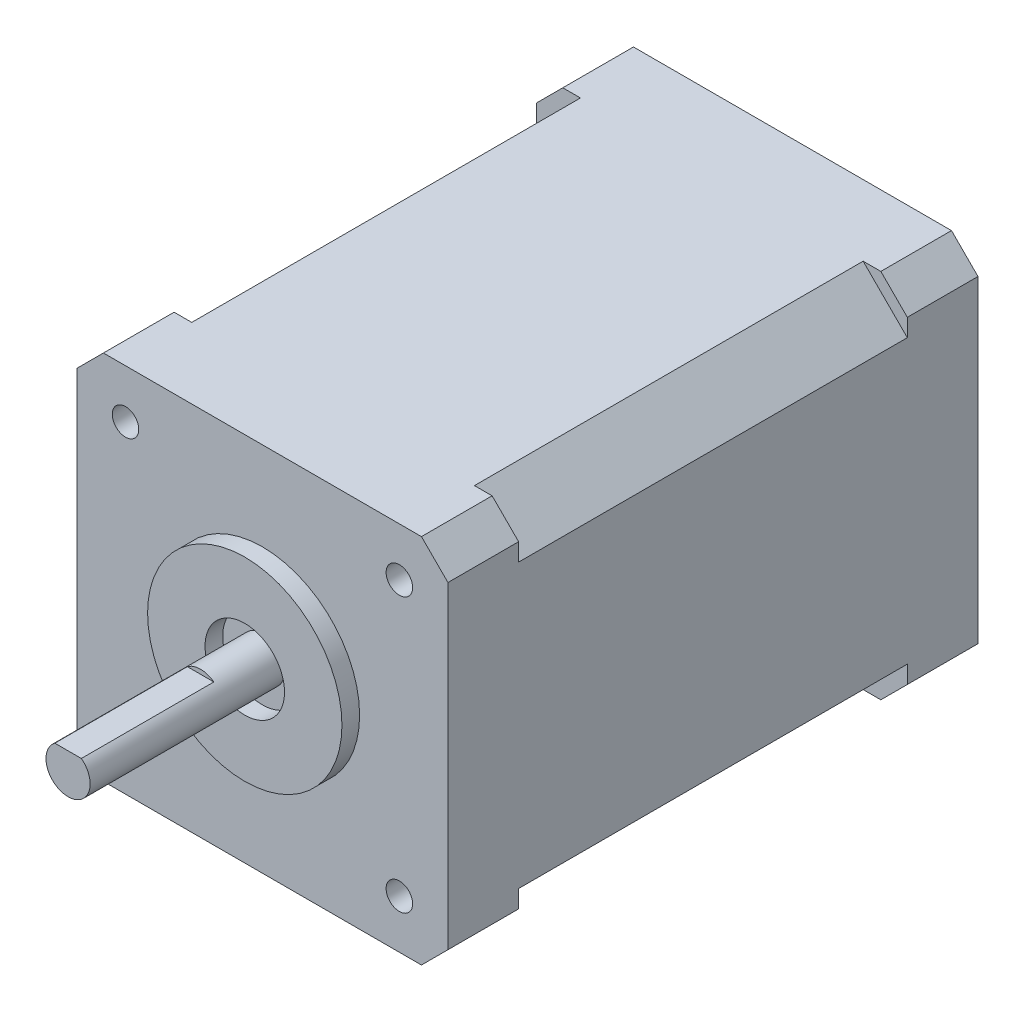
ISO-10303-21;
HEADER;
FILE_DESCRIPTION(('STEP AP214'),'2;1');
FILE_NAME('part.step','',(''),(''),'','','');
FILE_SCHEMA(('AUTOMOTIVE_DESIGN { 1 0 10303 214 1 1 1 1 }'));
ENDSEC;
DATA;
#1=APPLICATION_CONTEXT('core data for automotive mechanical design processes');
#2=APPLICATION_PROTOCOL_DEFINITION('international standard','automotive_design',2000,#1);
#3=PRODUCT_CONTEXT('',#1,'mechanical');
#4=PRODUCT('Part','Part','',(#3));
#5=PRODUCT_RELATED_PRODUCT_CATEGORY('part','',(#4));
#6=PRODUCT_DEFINITION_FORMATION('','',#4);
#7=PRODUCT_DEFINITION_CONTEXT('part definition',#1,'design');
#8=PRODUCT_DEFINITION('design','',#6,#7);
#9=PRODUCT_DEFINITION_SHAPE('','',#8);
#10=(LENGTH_UNIT() NAMED_UNIT(*) SI_UNIT(.MILLI.,.METRE.));
#11=(NAMED_UNIT(*) PLANE_ANGLE_UNIT() SI_UNIT($,.RADIAN.));
#12=(NAMED_UNIT(*) SI_UNIT($,.STERADIAN.) SOLID_ANGLE_UNIT());
#13=UNCERTAINTY_MEASURE_WITH_UNIT(LENGTH_MEASURE(1.E-05),#10,'distance_accuracy_value','');
#14=(GEOMETRIC_REPRESENTATION_CONTEXT(3) GLOBAL_UNCERTAINTY_ASSIGNED_CONTEXT((#13)) GLOBAL_UNIT_ASSIGNED_CONTEXT((#10,
#11,#12)) REPRESENTATION_CONTEXT('',''));
#15=CARTESIAN_POINT('',(0.,0.,0.));
#16=DIRECTION('',(0.,0.,1.));
#17=DIRECTION('',(1.,0.,0.));
#18=AXIS2_PLACEMENT_3D('',#15,#16,#17);
#19=CARTESIAN_POINT('',(0.,0.,52.));
#20=DIRECTION('',(0.,0.,-1.));
#21=DIRECTION('',(-1.,0.,0.));
#22=AXIS2_PLACEMENT_3D('',#19,#20,#21);
#23=PLANE('',#22);
#24=CARTESIAN_POINT('',(0.,0.,52.));
#25=DIRECTION('',(0.,0.,1.));
#26=DIRECTION('',(1.,0.,0.));
#27=AXIS2_PLACEMENT_3D('',#24,#25,#26);
#28=CIRCLE('',#27,4.5);
#29=CARTESIAN_POINT('',(4.5,0.,52.));
#30=VERTEX_POINT('',#29);
#31=EDGE_CURVE('E915',#30,#30,#28,.T.);
#32=ORIENTED_EDGE('',*,*,#31,.T.);
#33=EDGE_LOOP('',(#32));
#34=FACE_BOUND('',#33,.T.);
#35=CARTESIAN_POINT('',(0.,0.,52.));
#36=DIRECTION('',(0.,0.,-1.));
#37=DIRECTION('',(-1.,0.,0.));
#38=AXIS2_PLACEMENT_3D('',#35,#36,#37);
#39=CIRCLE('',#38,2.5);
#40=CARTESIAN_POINT('',(-2.5,0.,52.));
#41=VERTEX_POINT('',#40);
#42=EDGE_CURVE('E11',#41,#41,#39,.F.);
#43=ORIENTED_EDGE('',*,*,#42,.F.);
#44=EDGE_LOOP('',(#43));
#45=FACE_BOUND('',#44,.T.);
#46=ADVANCED_FACE('F37',(#34,#45),#23,.F.);
#47=CARTESIAN_POINT('',(-15.5,-15.5,52.));
#48=DIRECTION('',(0.,0.,1.));
#49=DIRECTION('',(1.,0.,0.));
#50=AXIS2_PLACEMENT_3D('',#47,#48,#49);
#51=CIRCLE('',#50,1.5);
#52=CARTESIAN_POINT('',(-14.,-15.5,52.));
#53=VERTEX_POINT('',#52);
#54=EDGE_CURVE('E878',#53,#53,#51,.T.);
#55=ORIENTED_EDGE('',*,*,#54,.F.);
#56=EDGE_LOOP('',(#55));
#57=FACE_BOUND('',#56,.T.);
#58=CARTESIAN_POINT('',(15.5,-15.5,52.));
#59=DIRECTION('',(0.,0.,1.));
#60=DIRECTION('',(1.,0.,0.));
#61=AXIS2_PLACEMENT_3D('',#58,#59,#60);
#62=CIRCLE('',#61,1.5);
#63=CARTESIAN_POINT('',(17.,-15.5,52.));
#64=VERTEX_POINT('',#63);
#65=EDGE_CURVE('E877',#64,#64,#62,.T.);
#66=ORIENTED_EDGE('',*,*,#65,.F.);
#67=EDGE_LOOP('',(#66));
#68=FACE_BOUND('',#67,.T.);
#69=CARTESIAN_POINT('',(15.5,15.5,52.));
#70=DIRECTION('',(0.,0.,1.));
#71=DIRECTION('',(1.,0.,0.));
#72=AXIS2_PLACEMENT_3D('',#69,#70,#71);
#73=CIRCLE('',#72,1.5);
#74=CARTESIAN_POINT('',(17.,15.5,52.));
#75=VERTEX_POINT('',#74);
#76=EDGE_CURVE('E887',#75,#75,#73,.T.);
#77=ORIENTED_EDGE('',*,*,#76,.F.);
#78=EDGE_LOOP('',(#77));
#79=FACE_BOUND('',#78,.T.);
#80=CARTESIAN_POINT('',(-15.5,15.5,52.));
#81=DIRECTION('',(0.,0.,1.));
#82=DIRECTION('',(1.,0.,0.));
#83=AXIS2_PLACEMENT_3D('',#80,#81,#82);
#84=CIRCLE('',#83,1.5);
#85=CARTESIAN_POINT('',(-14.,15.5,52.));
#86=VERTEX_POINT('',#85);
#87=EDGE_CURVE('E892',#86,#86,#84,.T.);
#88=ORIENTED_EDGE('',*,*,#87,.F.);
#89=EDGE_LOOP('',(#88));
#90=FACE_BOUND('',#89,.T.);
#91=DIRECTION('',(0.,-1.,0.));
#92=VECTOR('',#91,1.);
#93=CARTESIAN_POINT('',(-21.,-18.,52.));
#94=LINE('',#93,#92);
#95=CARTESIAN_POINT('',(-21.,18.,52.));
#96=VERTEX_POINT('',#95);
#97=CARTESIAN_POINT('',(-21.,-18.,52.));
#98=VERTEX_POINT('',#97);
#99=EDGE_CURVE('E377',#96,#98,#94,.T.);
#100=ORIENTED_EDGE('',*,*,#99,.T.);
#101=DIRECTION('',(0.707106781186548,-0.707106781186548,0.));
#102=VECTOR('',#101,1.);
#103=CARTESIAN_POINT('',(-21.,-18.,52.));
#104=LINE('',#103,#102);
#105=CARTESIAN_POINT('',(-18.,-21.,52.));
#106=VERTEX_POINT('',#105);
#107=EDGE_CURVE('E332',#98,#106,#104,.T.);
#108=ORIENTED_EDGE('',*,*,#107,.T.);
#109=DIRECTION('',(1.,0.,0.));
#110=VECTOR('',#109,1.);
#111=CARTESIAN_POINT('',(-18.,-21.,52.));
#112=LINE('',#111,#110);
#113=CARTESIAN_POINT('',(18.,-21.,52.));
#114=VERTEX_POINT('',#113);
#115=EDGE_CURVE('E511',#106,#114,#112,.T.);
#116=ORIENTED_EDGE('',*,*,#115,.T.);
#117=DIRECTION('',(0.707106781186548,0.707106781186548,0.));
#118=VECTOR('',#117,1.);
#119=CARTESIAN_POINT('',(18.,-21.,52.));
#120=LINE('',#119,#118);
#121=CARTESIAN_POINT('',(21.,-18.,52.));
#122=VERTEX_POINT('',#121);
#123=EDGE_CURVE('E508',#114,#122,#120,.T.);
#124=ORIENTED_EDGE('',*,*,#123,.T.);
#125=DIRECTION('',(0.,1.,0.));
#126=VECTOR('',#125,1.);
#127=CARTESIAN_POINT('',(21.,-18.,52.));
#128=LINE('',#127,#126);
#129=CARTESIAN_POINT('',(21.,18.,52.));
#130=VERTEX_POINT('',#129);
#131=EDGE_CURVE('E506',#122,#130,#128,.T.);
#132=ORIENTED_EDGE('',*,*,#131,.T.);
#133=DIRECTION('',(-0.707106781186548,0.707106781186548,0.));
#134=VECTOR('',#133,1.);
#135=CARTESIAN_POINT('',(18.,21.,52.));
#136=LINE('',#135,#134);
#137=CARTESIAN_POINT('',(18.,21.,52.));
#138=VERTEX_POINT('',#137);
#139=EDGE_CURVE('E356',#130,#138,#136,.T.);
#140=ORIENTED_EDGE('',*,*,#139,.T.);
#141=DIRECTION('',(-1.,0.,0.));
#142=VECTOR('',#141,1.);
#143=CARTESIAN_POINT('',(-18.,21.,52.));
#144=LINE('',#143,#142);
#145=CARTESIAN_POINT('',(-18.,21.,52.));
#146=VERTEX_POINT('',#145);
#147=EDGE_CURVE('E353',#138,#146,#144,.T.);
#148=ORIENTED_EDGE('',*,*,#147,.T.);
#149=DIRECTION('',(-0.707106781186548,-0.707106781186548,0.));
#150=VECTOR('',#149,1.);
#151=CARTESIAN_POINT('',(-21.,18.,52.));
#152=LINE('',#151,#150);
#153=EDGE_CURVE('E175',#146,#96,#152,.T.);
#154=ORIENTED_EDGE('',*,*,#153,.T.);
#155=EDGE_LOOP('',(#100,#108,#116,#124,#132,#140,#148,#154));
#156=FACE_BOUND('',#155,.T.);
#157=CARTESIAN_POINT('',(0.,0.,52.));
#158=DIRECTION('',(0.,0.,-1.));
#159=DIRECTION('',(-1.,0.,0.));
#160=AXIS2_PLACEMENT_3D('',#157,#158,#159);
#161=CIRCLE('',#160,11.);
#162=CARTESIAN_POINT('',(-11.,0.,52.));
#163=VERTEX_POINT('',#162);
#164=EDGE_CURVE('E45',#163,#163,#161,.F.);
#165=ORIENTED_EDGE('',*,*,#164,.F.);
#166=EDGE_LOOP('',(#165));
#167=FACE_BOUND('',#166,.T.);
#168=ADVANCED_FACE('F230',(#57,#68,#79,#90,#156,#167),#23,.F.);
#169=CARTESIAN_POINT('',(-21.,-16.,44.));
#170=DIRECTION('',(1.,0.,0.));
#171=DIRECTION('',(0.,0.,-1.));
#172=AXIS2_PLACEMENT_3D('',#169,#170,#171);
#173=PLANE('',#172);
#174=DIRECTION('',(0.,0.,-1.));
#175=VECTOR('',#174,1.);
#176=CARTESIAN_POINT('',(-21.,16.,44.));
#177=LINE('',#176,#175);
#178=CARTESIAN_POINT('',(-21.,16.,44.));
#179=VERTEX_POINT('',#178);
#180=CARTESIAN_POINT('',(-21.,16.,0.));
#181=VERTEX_POINT('',#180);
#182=EDGE_CURVE('E86',#179,#181,#177,.T.);
#183=ORIENTED_EDGE('',*,*,#182,.T.);
#184=DIRECTION('',(0.,1.,0.));
#185=VECTOR('',#184,1.);
#186=CARTESIAN_POINT('',(-21.,-18.,0.));
#187=LINE('',#186,#185);
#188=CARTESIAN_POINT('',(-21.,18.,0.));
#189=VERTEX_POINT('',#188);
#190=EDGE_CURVE('E388',#181,#189,#187,.T.);
#191=ORIENTED_EDGE('',*,*,#190,.T.);
#192=DIRECTION('',(0.,0.,1.));
#193=VECTOR('',#192,1.);
#194=CARTESIAN_POINT('',(-21.,18.,-8.));
#195=LINE('',#194,#193);
#196=CARTESIAN_POINT('',(-21.,18.,-8.));
#197=VERTEX_POINT('',#196);
#198=EDGE_CURVE('E955',#197,#189,#195,.T.);
#199=ORIENTED_EDGE('',*,*,#198,.F.);
#200=DIRECTION('',(0.,1.,0.));
#201=VECTOR('',#200,1.);
#202=CARTESIAN_POINT('',(-21.,-18.,-8.));
#203=LINE('',#202,#201);
#204=CARTESIAN_POINT('',(-21.,-18.,-8.));
#205=VERTEX_POINT('',#204);
#206=EDGE_CURVE('E935',#205,#197,#203,.T.);
#207=ORIENTED_EDGE('',*,*,#206,.F.);
#208=DIRECTION('',(0.,0.,1.));
#209=VECTOR('',#208,1.);
#210=CARTESIAN_POINT('',(-21.,-18.,-8.));
#211=LINE('',#210,#209);
#212=CARTESIAN_POINT('',(-21.,-18.,0.));
#213=VERTEX_POINT('',#212);
#214=EDGE_CURVE('E383',#205,#213,#211,.T.);
#215=ORIENTED_EDGE('',*,*,#214,.T.);
#216=CARTESIAN_POINT('',(-21.,-16.,0.));
#217=VERTEX_POINT('',#216);
#218=EDGE_CURVE('E379',#213,#217,#187,.T.);
#219=ORIENTED_EDGE('',*,*,#218,.T.);
#220=DIRECTION('',(0.,0.,-1.));
#221=VECTOR('',#220,1.);
#222=CARTESIAN_POINT('',(-21.,-16.,44.));
#223=LINE('',#222,#221);
#224=CARTESIAN_POINT('',(-21.,-16.,44.));
#225=VERTEX_POINT('',#224);
#226=EDGE_CURVE('E200',#225,#217,#223,.T.);
#227=ORIENTED_EDGE('',*,*,#226,.F.);
#228=DIRECTION('',(0.,-1.,0.));
#229=VECTOR('',#228,1.);
#230=CARTESIAN_POINT('',(-21.,-18.,44.));
#231=LINE('',#230,#229);
#232=CARTESIAN_POINT('',(-21.,-18.,44.));
#233=VERTEX_POINT('',#232);
#234=EDGE_CURVE('E165',#225,#233,#231,.T.);
#235=ORIENTED_EDGE('',*,*,#234,.T.);
#236=DIRECTION('',(0.,0.,-1.));
#237=VECTOR('',#236,1.);
#238=CARTESIAN_POINT('',(-21.,-18.,52.));
#239=LINE('',#238,#237);
#240=EDGE_CURVE('E212',#98,#233,#239,.T.);
#241=ORIENTED_EDGE('',*,*,#240,.F.);
#242=ORIENTED_EDGE('',*,*,#99,.F.);
#243=DIRECTION('',(0.,0.,-1.));
#244=VECTOR('',#243,1.);
#245=CARTESIAN_POINT('',(-21.,18.,52.));
#246=LINE('',#245,#244);
#247=CARTESIAN_POINT('',(-21.,18.,44.));
#248=VERTEX_POINT('',#247);
#249=EDGE_CURVE('E361',#96,#248,#246,.T.);
#250=ORIENTED_EDGE('',*,*,#249,.T.);
#251=EDGE_CURVE('E169',#248,#179,#231,.T.);
#252=ORIENTED_EDGE('',*,*,#251,.T.);
#253=EDGE_LOOP('',(#183,#191,#199,#207,#215,#219,#227,#235,#241,#242,#250,#252));
#254=FACE_BOUND('',#253,.T.);
#255=ADVANCED_FACE('F39',(#254),#173,.F.);
#256=CARTESIAN_POINT('',(-21.,-16.,44.));
#257=DIRECTION('',(0.707106781186548,0.707106781186548,0.));
#258=DIRECTION('',(-0.707106781186548,0.707106781186548,0.));
#259=AXIS2_PLACEMENT_3D('',#256,#257,#258);
#260=PLANE('',#259);
#261=DIRECTION('',(0.707106781186548,-0.707106781186548,0.));
#262=VECTOR('',#261,1.);
#263=CARTESIAN_POINT('',(-21.,-16.,0.));
#264=LINE('',#263,#262);
#265=CARTESIAN_POINT('',(-16.,-21.,0.));
#266=VERTEX_POINT('',#265);
#267=EDGE_CURVE('E208',#217,#266,#264,.T.);
#268=ORIENTED_EDGE('',*,*,#267,.T.);
#269=DIRECTION('',(0.,0.,-1.));
#270=VECTOR('',#269,1.);
#271=CARTESIAN_POINT('',(-16.,-21.,44.));
#272=LINE('',#271,#270);
#273=CARTESIAN_POINT('',(-16.,-21.,44.));
#274=VERTEX_POINT('',#273);
#275=EDGE_CURVE('E197',#274,#266,#272,.T.);
#276=ORIENTED_EDGE('',*,*,#275,.F.);
#277=DIRECTION('',(0.707106781186548,-0.707106781186548,0.));
#278=VECTOR('',#277,1.);
#279=CARTESIAN_POINT('',(-21.,-16.,44.));
#280=LINE('',#279,#278);
#281=EDGE_CURVE('E190',#225,#274,#280,.T.);
#282=ORIENTED_EDGE('',*,*,#281,.F.);
#283=ORIENTED_EDGE('',*,*,#226,.T.);
#284=EDGE_LOOP('',(#268,#276,#282,#283));
#285=FACE_BOUND('',#284,.T.);
#286=ADVANCED_FACE('F238',(#285),#260,.F.);
#287=CARTESIAN_POINT('',(-16.,-21.,44.));
#288=DIRECTION('',(0.,1.,0.));
#289=DIRECTION('',(0.,0.,1.));
#290=AXIS2_PLACEMENT_3D('',#287,#288,#289);
#291=PLANE('',#290);
#292=ORIENTED_EDGE('',*,*,#275,.T.);
#293=DIRECTION('',(-1.,0.,0.));
#294=VECTOR('',#293,1.);
#295=CARTESIAN_POINT('',(18.,-21.,0.));
#296=LINE('',#295,#294);
#297=CARTESIAN_POINT('',(-18.,-21.,0.));
#298=VERTEX_POINT('',#297);
#299=EDGE_CURVE('E75',#266,#298,#296,.T.);
#300=ORIENTED_EDGE('',*,*,#299,.T.);
#301=DIRECTION('',(0.,0.,1.));
#302=VECTOR('',#301,1.);
#303=CARTESIAN_POINT('',(-18.,-21.,-8.));
#304=LINE('',#303,#302);
#305=CARTESIAN_POINT('',(-18.,-21.,-8.));
#306=VERTEX_POINT('',#305);
#307=EDGE_CURVE('E440',#306,#298,#304,.T.);
#308=ORIENTED_EDGE('',*,*,#307,.F.);
#309=DIRECTION('',(-1.,0.,0.));
#310=VECTOR('',#309,1.);
#311=CARTESIAN_POINT('',(18.,-21.,-8.));
#312=LINE('',#311,#310);
#313=CARTESIAN_POINT('',(18.,-21.,-8.));
#314=VERTEX_POINT('',#313);
#315=EDGE_CURVE('E929',#314,#306,#312,.T.);
#316=ORIENTED_EDGE('',*,*,#315,.F.);
#317=DIRECTION('',(0.,0.,1.));
#318=VECTOR('',#317,1.);
#319=CARTESIAN_POINT('',(18.,-21.,-8.));
#320=LINE('',#319,#318);
#321=CARTESIAN_POINT('',(18.,-21.,0.));
#322=VERTEX_POINT('',#321);
#323=EDGE_CURVE('E959',#314,#322,#320,.T.);
#324=ORIENTED_EDGE('',*,*,#323,.T.);
#325=CARTESIAN_POINT('',(16.,-21.,0.));
#326=VERTEX_POINT('',#325);
#327=EDGE_CURVE('E430',#322,#326,#296,.T.);
#328=ORIENTED_EDGE('',*,*,#327,.T.);
#329=DIRECTION('',(0.,0.,-1.));
#330=VECTOR('',#329,1.);
#331=CARTESIAN_POINT('',(16.,-21.,44.));
#332=LINE('',#331,#330);
#333=CARTESIAN_POINT('',(16.,-21.,44.));
#334=VERTEX_POINT('',#333);
#335=EDGE_CURVE('E201',#334,#326,#332,.T.);
#336=ORIENTED_EDGE('',*,*,#335,.F.);
#337=DIRECTION('',(1.,0.,0.));
#338=VECTOR('',#337,1.);
#339=CARTESIAN_POINT('',(-18.,-21.,44.));
#340=LINE('',#339,#338);
#341=CARTESIAN_POINT('',(18.,-21.,44.));
#342=VERTEX_POINT('',#341);
#343=EDGE_CURVE('E180',#334,#342,#340,.T.);
#344=ORIENTED_EDGE('',*,*,#343,.T.);
#345=DIRECTION('',(0.,0.,-1.));
#346=VECTOR('',#345,1.);
#347=CARTESIAN_POINT('',(18.,-21.,52.));
#348=LINE('',#347,#346);
#349=EDGE_CURVE('E373',#114,#342,#348,.T.);
#350=ORIENTED_EDGE('',*,*,#349,.F.);
#351=ORIENTED_EDGE('',*,*,#115,.F.);
#352=DIRECTION('',(0.,0.,-1.));
#353=VECTOR('',#352,1.);
#354=CARTESIAN_POINT('',(-18.,-21.,52.));
#355=LINE('',#354,#353);
#356=CARTESIAN_POINT('',(-18.,-21.,44.));
#357=VERTEX_POINT('',#356);
#358=EDGE_CURVE('E303',#106,#357,#355,.T.);
#359=ORIENTED_EDGE('',*,*,#358,.T.);
#360=EDGE_CURVE('E145',#357,#274,#340,.T.);
#361=ORIENTED_EDGE('',*,*,#360,.T.);
#362=EDGE_LOOP('',(#292,#300,#308,#316,#324,#328,#336,#344,#350,#351,#359,#361));
#363=FACE_BOUND('',#362,.T.);
#364=ADVANCED_FACE('F282',(#363),#291,.F.);
#365=CARTESIAN_POINT('',(16.,-21.,44.));
#366=DIRECTION('',(-0.707106781186548,0.707106781186547,0.));
#367=DIRECTION('',(-0.707106781186547,-0.707106781186548,0.));
#368=AXIS2_PLACEMENT_3D('',#365,#366,#367);
#369=PLANE('',#368);
#370=DIRECTION('',(0.707106781186547,0.707106781186548,0.));
#371=VECTOR('',#370,1.);
#372=CARTESIAN_POINT('',(16.,-21.,0.));
#373=LINE('',#372,#371);
#374=CARTESIAN_POINT('',(21.,-16.,0.));
#375=VERTEX_POINT('',#374);
#376=EDGE_CURVE('E211',#326,#375,#373,.T.);
#377=ORIENTED_EDGE('',*,*,#376,.T.);
#378=DIRECTION('',(0.,0.,-1.));
#379=VECTOR('',#378,1.);
#380=CARTESIAN_POINT('',(21.,-16.,44.));
#381=LINE('',#380,#379);
#382=CARTESIAN_POINT('',(21.,-16.,44.));
#383=VERTEX_POINT('',#382);
#384=EDGE_CURVE('E122',#383,#375,#381,.T.);
#385=ORIENTED_EDGE('',*,*,#384,.F.);
#386=DIRECTION('',(0.707106781186547,0.707106781186548,0.));
#387=VECTOR('',#386,1.);
#388=CARTESIAN_POINT('',(16.,-21.,44.));
#389=LINE('',#388,#387);
#390=EDGE_CURVE('E133',#334,#383,#389,.T.);
#391=ORIENTED_EDGE('',*,*,#390,.F.);
#392=ORIENTED_EDGE('',*,*,#335,.T.);
#393=EDGE_LOOP('',(#377,#385,#391,#392));
#394=FACE_BOUND('',#393,.T.);
#395=ADVANCED_FACE('F279',(#394),#369,.F.);
#396=CARTESIAN_POINT('',(21.,-16.,44.));
#397=DIRECTION('',(-1.,0.,0.));
#398=DIRECTION('',(0.,0.,1.));
#399=AXIS2_PLACEMENT_3D('',#396,#397,#398);
#400=PLANE('',#399);
#401=ORIENTED_EDGE('',*,*,#384,.T.);
#402=DIRECTION('',(0.,-1.,0.));
#403=VECTOR('',#402,1.);
#404=CARTESIAN_POINT('',(21.,-18.,0.));
#405=LINE('',#404,#403);
#406=CARTESIAN_POINT('',(21.,-18.,0.));
#407=VERTEX_POINT('',#406);
#408=EDGE_CURVE('E412',#375,#407,#405,.T.);
#409=ORIENTED_EDGE('',*,*,#408,.T.);
#410=DIRECTION('',(0.,0.,1.));
#411=VECTOR('',#410,1.);
#412=CARTESIAN_POINT('',(21.,-18.,-8.));
#413=LINE('',#412,#411);
#414=CARTESIAN_POINT('',(21.,-18.,-8.));
#415=VERTEX_POINT('',#414);
#416=EDGE_CURVE('E170',#415,#407,#413,.T.);
#417=ORIENTED_EDGE('',*,*,#416,.F.);
#418=DIRECTION('',(0.,-1.,0.));
#419=VECTOR('',#418,1.);
#420=CARTESIAN_POINT('',(21.,-18.,-8.));
#421=LINE('',#420,#419);
#422=CARTESIAN_POINT('',(21.,18.,-8.));
#423=VERTEX_POINT('',#422);
#424=EDGE_CURVE('E923',#423,#415,#421,.T.);
#425=ORIENTED_EDGE('',*,*,#424,.F.);
#426=DIRECTION('',(0.,0.,1.));
#427=VECTOR('',#426,1.);
#428=CARTESIAN_POINT('',(21.,18.,-8.));
#429=LINE('',#428,#427);
#430=CARTESIAN_POINT('',(21.,18.,0.));
#431=VERTEX_POINT('',#430);
#432=EDGE_CURVE('E945',#423,#431,#429,.T.);
#433=ORIENTED_EDGE('',*,*,#432,.T.);
#434=CARTESIAN_POINT('',(21.,16.,0.));
#435=VERTEX_POINT('',#434);
#436=EDGE_CURVE('E119',#431,#435,#405,.T.);
#437=ORIENTED_EDGE('',*,*,#436,.T.);
#438=DIRECTION('',(0.,0.,-1.));
#439=VECTOR('',#438,1.);
#440=CARTESIAN_POINT('',(21.,16.,44.));
#441=LINE('',#440,#439);
#442=CARTESIAN_POINT('',(21.,16.,44.));
#443=VERTEX_POINT('',#442);
#444=EDGE_CURVE('E107',#443,#435,#441,.T.);
#445=ORIENTED_EDGE('',*,*,#444,.F.);
#446=DIRECTION('',(0.,1.,0.));
#447=VECTOR('',#446,1.);
#448=CARTESIAN_POINT('',(21.,-18.,44.));
#449=LINE('',#448,#447);
#450=CARTESIAN_POINT('',(21.,18.,44.));
#451=VERTEX_POINT('',#450);
#452=EDGE_CURVE('E114',#443,#451,#449,.T.);
#453=ORIENTED_EDGE('',*,*,#452,.T.);
#454=DIRECTION('',(0.,0.,-1.));
#455=VECTOR('',#454,1.);
#456=CARTESIAN_POINT('',(21.,18.,52.));
#457=LINE('',#456,#455);
#458=EDGE_CURVE('E368',#130,#451,#457,.T.);
#459=ORIENTED_EDGE('',*,*,#458,.F.);
#460=ORIENTED_EDGE('',*,*,#131,.F.);
#461=DIRECTION('',(0.,0.,-1.));
#462=VECTOR('',#461,1.);
#463=CARTESIAN_POINT('',(21.,-18.,52.));
#464=LINE('',#463,#462);
#465=CARTESIAN_POINT('',(21.,-18.,44.));
#466=VERTEX_POINT('',#465);
#467=EDGE_CURVE('E370',#122,#466,#464,.T.);
#468=ORIENTED_EDGE('',*,*,#467,.T.);
#469=EDGE_CURVE('E139',#466,#383,#449,.T.);
#470=ORIENTED_EDGE('',*,*,#469,.T.);
#471=EDGE_LOOP('',(#401,#409,#417,#425,#433,#437,#445,#453,#459,#460,#468,#470));
#472=FACE_BOUND('',#471,.T.);
#473=ADVANCED_FACE('F110',(#472),#400,.F.);
#474=CARTESIAN_POINT('',(16.,21.,44.));
#475=DIRECTION('',(-0.707106781186548,-0.707106781186548,0.));
#476=DIRECTION('',(0.707106781186548,-0.707106781186548,0.));
#477=AXIS2_PLACEMENT_3D('',#474,#475,#476);
#478=PLANE('',#477);
#479=DIRECTION('',(-0.707106781186548,0.707106781186548,0.));
#480=VECTOR('',#479,1.);
#481=CARTESIAN_POINT('',(16.,21.,0.));
#482=LINE('',#481,#480);
#483=CARTESIAN_POINT('',(16.,21.,0.));
#484=VERTEX_POINT('',#483);
#485=EDGE_CURVE('E224',#435,#484,#482,.T.);
#486=ORIENTED_EDGE('',*,*,#485,.T.);
#487=DIRECTION('',(0.,0.,-1.));
#488=VECTOR('',#487,1.);
#489=CARTESIAN_POINT('',(16.,21.,44.));
#490=LINE('',#489,#488);
#491=CARTESIAN_POINT('',(16.,21.,44.));
#492=VERTEX_POINT('',#491);
#493=EDGE_CURVE('E123',#492,#484,#490,.T.);
#494=ORIENTED_EDGE('',*,*,#493,.F.);
#495=DIRECTION('',(-0.707106781186548,0.707106781186548,0.));
#496=VECTOR('',#495,1.);
#497=CARTESIAN_POINT('',(16.,21.,44.));
#498=LINE('',#497,#496);
#499=EDGE_CURVE('E126',#443,#492,#498,.T.);
#500=ORIENTED_EDGE('',*,*,#499,.F.);
#501=ORIENTED_EDGE('',*,*,#444,.T.);
#502=EDGE_LOOP('',(#486,#494,#500,#501));
#503=FACE_BOUND('',#502,.T.);
#504=ADVANCED_FACE('F127',(#503),#478,.F.);
#505=CARTESIAN_POINT('',(-16.,21.,44.));
#506=DIRECTION('',(0.,-1.,0.));
#507=DIRECTION('',(0.,0.,-1.));
#508=AXIS2_PLACEMENT_3D('',#505,#506,#507);
#509=PLANE('',#508);
#510=ORIENTED_EDGE('',*,*,#493,.T.);
#511=DIRECTION('',(1.,0.,0.));
#512=VECTOR('',#511,1.);
#513=CARTESIAN_POINT('',(18.,21.,0.));
#514=LINE('',#513,#512);
#515=CARTESIAN_POINT('',(18.,21.,0.));
#516=VERTEX_POINT('',#515);
#517=EDGE_CURVE('E391',#484,#516,#514,.T.);
#518=ORIENTED_EDGE('',*,*,#517,.T.);
#519=DIRECTION('',(0.,0.,1.));
#520=VECTOR('',#519,1.);
#521=CARTESIAN_POINT('',(18.,21.,-8.));
#522=LINE('',#521,#520);
#523=CARTESIAN_POINT('',(18.,21.,-8.));
#524=VERTEX_POINT('',#523);
#525=EDGE_CURVE('E948',#524,#516,#522,.T.);
#526=ORIENTED_EDGE('',*,*,#525,.F.);
#527=DIRECTION('',(1.,0.,0.));
#528=VECTOR('',#527,1.);
#529=CARTESIAN_POINT('',(18.,21.,-8.));
#530=LINE('',#529,#528);
#531=CARTESIAN_POINT('',(-18.,21.,-8.));
#532=VERTEX_POINT('',#531);
#533=EDGE_CURVE('E940',#532,#524,#530,.T.);
#534=ORIENTED_EDGE('',*,*,#533,.F.);
#535=DIRECTION('',(0.,0.,1.));
#536=VECTOR('',#535,1.);
#537=CARTESIAN_POINT('',(-18.,21.,-8.));
#538=LINE('',#537,#536);
#539=CARTESIAN_POINT('',(-18.,21.,0.));
#540=VERTEX_POINT('',#539);
#541=EDGE_CURVE('E950',#532,#540,#538,.T.);
#542=ORIENTED_EDGE('',*,*,#541,.T.);
#543=CARTESIAN_POINT('',(-16.,21.,0.));
#544=VERTEX_POINT('',#543);
#545=EDGE_CURVE('E410',#540,#544,#514,.T.);
#546=ORIENTED_EDGE('',*,*,#545,.T.);
#547=DIRECTION('',(0.,0.,-1.));
#548=VECTOR('',#547,1.);
#549=CARTESIAN_POINT('',(-16.,21.,44.));
#550=LINE('',#549,#548);
#551=CARTESIAN_POINT('',(-16.,21.,44.));
#552=VERTEX_POINT('',#551);
#553=EDGE_CURVE('E61',#552,#544,#550,.T.);
#554=ORIENTED_EDGE('',*,*,#553,.F.);
#555=DIRECTION('',(-1.,0.,0.));
#556=VECTOR('',#555,1.);
#557=CARTESIAN_POINT('',(-18.,21.,44.));
#558=LINE('',#557,#556);
#559=CARTESIAN_POINT('',(-18.,21.,44.));
#560=VERTEX_POINT('',#559);
#561=EDGE_CURVE('E156',#552,#560,#558,.T.);
#562=ORIENTED_EDGE('',*,*,#561,.T.);
#563=DIRECTION('',(0.,0.,-1.));
#564=VECTOR('',#563,1.);
#565=CARTESIAN_POINT('',(-18.,21.,52.));
#566=LINE('',#565,#564);
#567=EDGE_CURVE('E359',#146,#560,#566,.T.);
#568=ORIENTED_EDGE('',*,*,#567,.F.);
#569=ORIENTED_EDGE('',*,*,#147,.F.);
#570=DIRECTION('',(0.,0.,-1.));
#571=VECTOR('',#570,1.);
#572=CARTESIAN_POINT('',(18.,21.,52.));
#573=LINE('',#572,#571);
#574=CARTESIAN_POINT('',(18.,21.,44.));
#575=VERTEX_POINT('',#574);
#576=EDGE_CURVE('E360',#138,#575,#573,.T.);
#577=ORIENTED_EDGE('',*,*,#576,.T.);
#578=EDGE_CURVE('E163',#575,#492,#558,.T.);
#579=ORIENTED_EDGE('',*,*,#578,.T.);
#580=EDGE_LOOP('',(#510,#518,#526,#534,#542,#546,#554,#562,#568,#569,#577,#579));
#581=FACE_BOUND('',#580,.T.);
#582=ADVANCED_FACE('F272',(#581),#509,.F.);
#583=CARTESIAN_POINT('',(-21.,16.,44.));
#584=DIRECTION('',(0.707106781186548,-0.707106781186547,0.));
#585=DIRECTION('',(0.707106781186547,0.707106781186548,0.));
#586=AXIS2_PLACEMENT_3D('',#583,#584,#585);
#587=PLANE('',#586);
#588=DIRECTION('',(-0.707106781186547,-0.707106781186548,0.));
#589=VECTOR('',#588,1.);
#590=CARTESIAN_POINT('',(-21.,16.,0.));
#591=LINE('',#590,#589);
#592=EDGE_CURVE('E194',#544,#181,#591,.T.);
#593=ORIENTED_EDGE('',*,*,#592,.T.);
#594=ORIENTED_EDGE('',*,*,#182,.F.);
#595=DIRECTION('',(-0.707106781186547,-0.707106781186548,0.));
#596=VECTOR('',#595,1.);
#597=CARTESIAN_POINT('',(-21.,16.,44.));
#598=LINE('',#597,#596);
#599=EDGE_CURVE('E132',#552,#179,#598,.T.);
#600=ORIENTED_EDGE('',*,*,#599,.F.);
#601=ORIENTED_EDGE('',*,*,#553,.T.);
#602=EDGE_LOOP('',(#593,#594,#600,#601));
#603=FACE_BOUND('',#602,.T.);
#604=ADVANCED_FACE('F269',(#603),#587,.F.);
#605=CARTESIAN_POINT('',(0.,0.,44.));
#606=DIRECTION('',(0.,0.,-1.));
#607=DIRECTION('',(-1.,0.,0.));
#608=AXIS2_PLACEMENT_3D('',#605,#606,#607);
#609=PLANE('',#608);
#610=ORIENTED_EDGE('',*,*,#234,.F.);
#611=ORIENTED_EDGE('',*,*,#281,.T.);
#612=ORIENTED_EDGE('',*,*,#360,.F.);
#613=DIRECTION('',(0.707106781186548,-0.707106781186548,0.));
#614=VECTOR('',#613,1.);
#615=CARTESIAN_POINT('',(-21.,-18.,44.));
#616=LINE('',#615,#614);
#617=EDGE_CURVE('E177',#233,#357,#616,.T.);
#618=ORIENTED_EDGE('',*,*,#617,.F.);
#619=EDGE_LOOP('',(#610,#611,#612,#618));
#620=FACE_BOUND('',#619,.T.);
#621=ADVANCED_FACE('F253',(#620),#609,.T.);
#622=ORIENTED_EDGE('',*,*,#343,.F.);
#623=ORIENTED_EDGE('',*,*,#390,.T.);
#624=ORIENTED_EDGE('',*,*,#469,.F.);
#625=DIRECTION('',(0.707106781186548,0.707106781186548,0.));
#626=VECTOR('',#625,1.);
#627=CARTESIAN_POINT('',(18.,-21.,44.));
#628=LINE('',#627,#626);
#629=EDGE_CURVE('E140',#342,#466,#628,.T.);
#630=ORIENTED_EDGE('',*,*,#629,.F.);
#631=EDGE_LOOP('',(#622,#623,#624,#630));
#632=FACE_BOUND('',#631,.T.);
#633=ADVANCED_FACE('F520',(#632),#609,.T.);
#634=ORIENTED_EDGE('',*,*,#452,.F.);
#635=ORIENTED_EDGE('',*,*,#499,.T.);
#636=ORIENTED_EDGE('',*,*,#578,.F.);
#637=DIRECTION('',(-0.707106781186548,0.707106781186548,0.));
#638=VECTOR('',#637,1.);
#639=CARTESIAN_POINT('',(18.,21.,44.));
#640=LINE('',#639,#638);
#641=EDGE_CURVE('E138',#451,#575,#640,.T.);
#642=ORIENTED_EDGE('',*,*,#641,.F.);
#643=EDGE_LOOP('',(#634,#635,#636,#642));
#644=FACE_BOUND('',#643,.T.);
#645=ADVANCED_FACE('F136',(#644),#609,.T.);
#646=CARTESIAN_POINT('',(-21.,-18.,52.));
#647=DIRECTION('',(0.707106781186547,0.707106781186547,0.));
#648=DIRECTION('',(-0.707106781186548,0.707106781186548,0.));
#649=AXIS2_PLACEMENT_3D('',#646,#647,#648);
#650=PLANE('',#649);
#651=ORIENTED_EDGE('',*,*,#617,.T.);
#652=ORIENTED_EDGE('',*,*,#358,.F.);
#653=ORIENTED_EDGE('',*,*,#107,.F.);
#654=ORIENTED_EDGE('',*,*,#240,.T.);
#655=EDGE_LOOP('',(#651,#652,#653,#654));
#656=FACE_BOUND('',#655,.T.);
#657=ADVANCED_FACE('F264',(#656),#650,.F.);
#658=CARTESIAN_POINT('',(18.,-21.,52.));
#659=DIRECTION('',(-0.707106781186547,0.707106781186547,0.));
#660=DIRECTION('',(-0.707106781186548,-0.707106781186548,0.));
#661=AXIS2_PLACEMENT_3D('',#658,#659,#660);
#662=PLANE('',#661);
#663=ORIENTED_EDGE('',*,*,#629,.T.);
#664=ORIENTED_EDGE('',*,*,#467,.F.);
#665=ORIENTED_EDGE('',*,*,#123,.F.);
#666=ORIENTED_EDGE('',*,*,#349,.T.);
#667=EDGE_LOOP('',(#663,#664,#665,#666));
#668=FACE_BOUND('',#667,.T.);
#669=ADVANCED_FACE('F260',(#668),#662,.F.);
#670=CARTESIAN_POINT('',(18.,21.,52.));
#671=DIRECTION('',(-0.707106781186547,-0.707106781186547,0.));
#672=DIRECTION('',(0.707106781186548,-0.707106781186548,0.));
#673=AXIS2_PLACEMENT_3D('',#670,#671,#672);
#674=PLANE('',#673);
#675=ORIENTED_EDGE('',*,*,#641,.T.);
#676=ORIENTED_EDGE('',*,*,#576,.F.);
#677=ORIENTED_EDGE('',*,*,#139,.F.);
#678=ORIENTED_EDGE('',*,*,#458,.T.);
#679=EDGE_LOOP('',(#675,#676,#677,#678));
#680=FACE_BOUND('',#679,.T.);
#681=ADVANCED_FACE('F256',(#680),#674,.F.);
#682=CARTESIAN_POINT('',(-21.,18.,52.));
#683=DIRECTION('',(0.707106781186547,-0.707106781186547,0.));
#684=DIRECTION('',(0.707106781186548,0.707106781186548,0.));
#685=AXIS2_PLACEMENT_3D('',#682,#683,#684);
#686=PLANE('',#685);
#687=DIRECTION('',(-0.707106781186548,-0.707106781186548,0.));
#688=VECTOR('',#687,1.);
#689=CARTESIAN_POINT('',(-21.,18.,44.));
#690=LINE('',#689,#688);
#691=EDGE_CURVE('E159',#560,#248,#690,.T.);
#692=ORIENTED_EDGE('',*,*,#691,.T.);
#693=ORIENTED_EDGE('',*,*,#249,.F.);
#694=ORIENTED_EDGE('',*,*,#153,.F.);
#695=ORIENTED_EDGE('',*,*,#567,.T.);
#696=EDGE_LOOP('',(#692,#693,#694,#695));
#697=FACE_BOUND('',#696,.T.);
#698=ADVANCED_FACE('F251',(#697),#686,.F.);
#699=ORIENTED_EDGE('',*,*,#561,.F.);
#700=ORIENTED_EDGE('',*,*,#599,.T.);
#701=ORIENTED_EDGE('',*,*,#251,.F.);
#702=ORIENTED_EDGE('',*,*,#691,.F.);
#703=EDGE_LOOP('',(#699,#700,#701,#702));
#704=FACE_BOUND('',#703,.T.);
#705=ADVANCED_FACE('F247',(#704),#609,.T.);
#706=CARTESIAN_POINT('',(0.,0.,0.));
#707=DIRECTION('',(0.,0.,1.));
#708=DIRECTION('',(1.,0.,0.));
#709=AXIS2_PLACEMENT_3D('',#706,#707,#708);
#710=PLANE('',#709);
#711=ORIENTED_EDGE('',*,*,#592,.F.);
#712=ORIENTED_EDGE('',*,*,#545,.F.);
#713=DIRECTION('',(0.707106781186548,0.707106781186548,0.));
#714=VECTOR('',#713,1.);
#715=CARTESIAN_POINT('',(-18.,21.,0.));
#716=LINE('',#715,#714);
#717=EDGE_CURVE('E387',#189,#540,#716,.T.);
#718=ORIENTED_EDGE('',*,*,#717,.F.);
#719=ORIENTED_EDGE('',*,*,#190,.F.);
#720=EDGE_LOOP('',(#711,#712,#718,#719));
#721=FACE_BOUND('',#720,.T.);
#722=ADVANCED_FACE('F250',(#721),#710,.T.);
#723=ORIENTED_EDGE('',*,*,#485,.F.);
#724=ORIENTED_EDGE('',*,*,#436,.F.);
#725=DIRECTION('',(0.707106781186548,-0.707106781186548,0.));
#726=VECTOR('',#725,1.);
#727=CARTESIAN_POINT('',(21.,18.,0.));
#728=LINE('',#727,#726);
#729=EDGE_CURVE('E407',#516,#431,#728,.T.);
#730=ORIENTED_EDGE('',*,*,#729,.F.);
#731=ORIENTED_EDGE('',*,*,#517,.F.);
#732=EDGE_LOOP('',(#723,#724,#730,#731));
#733=FACE_BOUND('',#732,.T.);
#734=ADVANCED_FACE('F648',(#733),#710,.T.);
#735=ORIENTED_EDGE('',*,*,#376,.F.);
#736=ORIENTED_EDGE('',*,*,#327,.F.);
#737=DIRECTION('',(-0.707106781186548,-0.707106781186548,0.));
#738=VECTOR('',#737,1.);
#739=CARTESIAN_POINT('',(21.,-18.,0.));
#740=LINE('',#739,#738);
#741=EDGE_CURVE('E423',#407,#322,#740,.T.);
#742=ORIENTED_EDGE('',*,*,#741,.F.);
#743=ORIENTED_EDGE('',*,*,#408,.F.);
#744=EDGE_LOOP('',(#735,#736,#742,#743));
#745=FACE_BOUND('',#744,.T.);
#746=ADVANCED_FACE('F475',(#745),#710,.T.);
#747=ORIENTED_EDGE('',*,*,#267,.F.);
#748=ORIENTED_EDGE('',*,*,#218,.F.);
#749=DIRECTION('',(-0.707106781186548,0.707106781186548,0.));
#750=VECTOR('',#749,1.);
#751=CARTESIAN_POINT('',(-18.,-21.,0.));
#752=LINE('',#751,#750);
#753=EDGE_CURVE('E394',#298,#213,#752,.T.);
#754=ORIENTED_EDGE('',*,*,#753,.F.);
#755=ORIENTED_EDGE('',*,*,#299,.F.);
#756=EDGE_LOOP('',(#747,#748,#754,#755));
#757=FACE_BOUND('',#756,.T.);
#758=ADVANCED_FACE('F443',(#757),#710,.T.);
#759=CARTESIAN_POINT('',(21.,-18.,-8.));
#760=DIRECTION('',(-0.707106781186547,0.707106781186547,0.));
#761=DIRECTION('',(-0.707106781186548,-0.707106781186548,0.));
#762=AXIS2_PLACEMENT_3D('',#759,#760,#761);
#763=PLANE('',#762);
#764=ORIENTED_EDGE('',*,*,#741,.T.);
#765=ORIENTED_EDGE('',*,*,#323,.F.);
#766=DIRECTION('',(-0.707106781186548,-0.707106781186548,0.));
#767=VECTOR('',#766,1.);
#768=CARTESIAN_POINT('',(21.,-18.,-8.));
#769=LINE('',#768,#767);
#770=EDGE_CURVE('E926',#415,#314,#769,.T.);
#771=ORIENTED_EDGE('',*,*,#770,.F.);
#772=ORIENTED_EDGE('',*,*,#416,.T.);
#773=EDGE_LOOP('',(#764,#765,#771,#772));
#774=FACE_BOUND('',#773,.T.);
#775=ADVANCED_FACE('F245',(#774),#763,.F.);
#776=CARTESIAN_POINT('',(-18.,-21.,-8.));
#777=DIRECTION('',(0.707106781186547,0.707106781186547,0.));
#778=DIRECTION('',(-0.707106781186548,0.707106781186548,0.));
#779=AXIS2_PLACEMENT_3D('',#776,#777,#778);
#780=PLANE('',#779);
#781=ORIENTED_EDGE('',*,*,#753,.T.);
#782=ORIENTED_EDGE('',*,*,#214,.F.);
#783=DIRECTION('',(-0.707106781186548,0.707106781186548,0.));
#784=VECTOR('',#783,1.);
#785=CARTESIAN_POINT('',(-18.,-21.,-8.));
#786=LINE('',#785,#784);
#787=EDGE_CURVE('E932',#306,#205,#786,.T.);
#788=ORIENTED_EDGE('',*,*,#787,.F.);
#789=ORIENTED_EDGE('',*,*,#307,.T.);
#790=EDGE_LOOP('',(#781,#782,#788,#789));
#791=FACE_BOUND('',#790,.T.);
#792=ADVANCED_FACE('F437',(#791),#780,.F.);
#793=CARTESIAN_POINT('',(-18.,21.,-8.));
#794=DIRECTION('',(0.707106781186547,-0.707106781186547,0.));
#795=DIRECTION('',(0.707106781186548,0.707106781186548,0.));
#796=AXIS2_PLACEMENT_3D('',#793,#794,#795);
#797=PLANE('',#796);
#798=ORIENTED_EDGE('',*,*,#717,.T.);
#799=ORIENTED_EDGE('',*,*,#541,.F.);
#800=DIRECTION('',(0.707106781186548,0.707106781186548,0.));
#801=VECTOR('',#800,1.);
#802=CARTESIAN_POINT('',(-18.,21.,-8.));
#803=LINE('',#802,#801);
#804=EDGE_CURVE('E938',#197,#532,#803,.T.);
#805=ORIENTED_EDGE('',*,*,#804,.F.);
#806=ORIENTED_EDGE('',*,*,#198,.T.);
#807=EDGE_LOOP('',(#798,#799,#805,#806));
#808=FACE_BOUND('',#807,.T.);
#809=ADVANCED_FACE('F681',(#808),#797,.F.);
#810=CARTESIAN_POINT('',(21.,18.,-8.));
#811=DIRECTION('',(-0.707106781186547,-0.707106781186547,0.));
#812=DIRECTION('',(0.707106781186548,-0.707106781186548,0.));
#813=AXIS2_PLACEMENT_3D('',#810,#811,#812);
#814=PLANE('',#813);
#815=ORIENTED_EDGE('',*,*,#729,.T.);
#816=ORIENTED_EDGE('',*,*,#432,.F.);
#817=DIRECTION('',(0.707106781186548,-0.707106781186548,0.));
#818=VECTOR('',#817,1.);
#819=CARTESIAN_POINT('',(21.,18.,-8.));
#820=LINE('',#819,#818);
#821=EDGE_CURVE('E421',#524,#423,#820,.T.);
#822=ORIENTED_EDGE('',*,*,#821,.F.);
#823=ORIENTED_EDGE('',*,*,#525,.T.);
#824=EDGE_LOOP('',(#815,#816,#822,#823));
#825=FACE_BOUND('',#824,.T.);
#826=ADVANCED_FACE('F688',(#825),#814,.F.);
#827=CARTESIAN_POINT('',(0.,0.,-8.));
#828=DIRECTION('',(0.,0.,1.));
#829=DIRECTION('',(1.,0.,0.));
#830=AXIS2_PLACEMENT_3D('',#827,#828,#829);
#831=PLANE('',#830);
#832=ORIENTED_EDGE('',*,*,#424,.T.);
#833=ORIENTED_EDGE('',*,*,#770,.T.);
#834=ORIENTED_EDGE('',*,*,#315,.T.);
#835=ORIENTED_EDGE('',*,*,#787,.T.);
#836=ORIENTED_EDGE('',*,*,#206,.T.);
#837=ORIENTED_EDGE('',*,*,#804,.T.);
#838=ORIENTED_EDGE('',*,*,#533,.T.);
#839=ORIENTED_EDGE('',*,*,#821,.T.);
#840=EDGE_LOOP('',(#832,#833,#834,#835,#836,#837,#838,#839));
#841=FACE_BOUND('',#840,.T.);
#842=ADVANCED_FACE('F697',(#841),#831,.F.);
#843=CARTESIAN_POINT('',(0.,0.,54.));
#844=DIRECTION('',(0.,0.,1.));
#845=DIRECTION('',(1.,0.,0.));
#846=AXIS2_PLACEMENT_3D('',#843,#844,#845);
#847=PLANE('',#846);
#848=CARTESIAN_POINT('',(0.,0.,54.));
#849=DIRECTION('',(0.,0.,1.));
#850=DIRECTION('',(1.,0.,0.));
#851=AXIS2_PLACEMENT_3D('',#848,#849,#850);
#852=CIRCLE('',#851,11.);
#853=CARTESIAN_POINT('',(11.,0.,54.));
#854=VERTEX_POINT('',#853);
#855=EDGE_CURVE('E416',#854,#854,#852,.T.);
#856=ORIENTED_EDGE('',*,*,#855,.T.);
#857=EDGE_LOOP('',(#856));
#858=FACE_BOUND('',#857,.T.);
#859=CARTESIAN_POINT('',(0.,0.,54.));
#860=DIRECTION('',(0.,0.,1.));
#861=DIRECTION('',(1.,0.,0.));
#862=AXIS2_PLACEMENT_3D('',#859,#860,#861);
#863=CIRCLE('',#862,4.5);
#864=CARTESIAN_POINT('',(4.5,0.,54.));
#865=VERTEX_POINT('',#864);
#866=EDGE_CURVE('E916',#865,#865,#863,.T.);
#867=ORIENTED_EDGE('',*,*,#866,.F.);
#868=EDGE_LOOP('',(#867));
#869=FACE_BOUND('',#868,.T.);
#870=ADVANCED_FACE('F706',(#858,#869),#847,.T.);
#871=CARTESIAN_POINT('',(0.,0.,54.));
#872=DIRECTION('',(0.,0.,-1.));
#873=DIRECTION('',(-1.,0.,0.));
#874=AXIS2_PLACEMENT_3D('',#871,#872,#873);
#875=CYLINDRICAL_SURFACE('',#874,11.);
#876=ORIENTED_EDGE('',*,*,#855,.F.);
#877=EDGE_LOOP('',(#876));
#878=FACE_BOUND('',#877,.T.);
#879=ORIENTED_EDGE('',*,*,#164,.T.);
#880=EDGE_LOOP('',(#879));
#881=FACE_BOUND('',#880,.T.);
#882=ADVANCED_FACE('F228',(#878,#881),#875,.T.);
#883=CARTESIAN_POINT('',(0.,0.,54.));
#884=DIRECTION('',(0.,0.,-1.));
#885=DIRECTION('',(-1.,0.,0.));
#886=AXIS2_PLACEMENT_3D('',#883,#884,#885);
#887=CYLINDRICAL_SURFACE('',#886,4.5);
#888=ORIENTED_EDGE('',*,*,#866,.T.);
#889=EDGE_LOOP('',(#888));
#890=FACE_BOUND('',#889,.T.);
#891=ORIENTED_EDGE('',*,*,#31,.F.);
#892=EDGE_LOOP('',(#891));
#893=FACE_BOUND('',#892,.T.);
#894=ADVANCED_FACE('F729',(#890,#893),#887,.F.);
#895=CARTESIAN_POINT('',(0.,0.,74.));
#896=DIRECTION('',(0.,0.,-1.));
#897=DIRECTION('',(-1.,0.,0.));
#898=AXIS2_PLACEMENT_3D('',#895,#896,#897);
#899=CYLINDRICAL_SURFACE('',#898,2.5);
#900=CARTESIAN_POINT('',(0.,0.,74.));
#901=DIRECTION('',(0.,0.,1.));
#902=DIRECTION('',(1.,0.,0.));
#903=AXIS2_PLACEMENT_3D('',#900,#901,#902);
#904=CIRCLE('',#903,2.5);
#905=CARTESIAN_POINT('',(-1.5,2.,74.));
#906=VERTEX_POINT('',#905);
#907=CARTESIAN_POINT('',(1.5,2.,74.));
#908=VERTEX_POINT('',#907);
#909=EDGE_CURVE('E911',#906,#908,#904,.T.);
#910=ORIENTED_EDGE('',*,*,#909,.F.);
#911=DIRECTION('',(0.,0.,1.));
#912=VECTOR('',#911,1.);
#913=CARTESIAN_POINT('',(-1.5,2.,59.));
#914=LINE('',#913,#912);
#915=CARTESIAN_POINT('',(-1.5,2.,59.));
#916=VERTEX_POINT('',#915);
#917=EDGE_CURVE('E52',#916,#906,#914,.T.);
#918=ORIENTED_EDGE('',*,*,#917,.F.);
#919=CARTESIAN_POINT('',(0.,0.,59.));
#920=DIRECTION('',(0.,0.,1.));
#921=DIRECTION('',(1.,0.,0.));
#922=AXIS2_PLACEMENT_3D('',#919,#920,#921);
#923=CIRCLE('',#922,2.5);
#924=CARTESIAN_POINT('',(1.5,2.,59.));
#925=VERTEX_POINT('',#924);
#926=EDGE_CURVE('E901',#925,#916,#923,.T.);
#927=ORIENTED_EDGE('',*,*,#926,.F.);
#928=DIRECTION('',(0.,0.,1.));
#929=VECTOR('',#928,1.);
#930=CARTESIAN_POINT('',(1.5,2.,59.));
#931=LINE('',#930,#929);
#932=EDGE_CURVE('E908',#925,#908,#931,.T.);
#933=ORIENTED_EDGE('',*,*,#932,.T.);
#934=EDGE_LOOP('',(#910,#918,#927,#933));
#935=FACE_BOUND('',#934,.T.);
#936=ORIENTED_EDGE('',*,*,#42,.T.);
#937=EDGE_LOOP('',(#936));
#938=FACE_BOUND('',#937,.T.);
#939=ADVANCED_FACE('F738',(#935,#938),#899,.T.);
#940=CARTESIAN_POINT('',(0.,0.,74.));
#941=DIRECTION('',(0.,0.,1.));
#942=DIRECTION('',(1.,0.,0.));
#943=AXIS2_PLACEMENT_3D('',#940,#941,#942);
#944=PLANE('',#943);
#945=DIRECTION('',(1.,0.,0.));
#946=VECTOR('',#945,1.);
#947=CARTESIAN_POINT('',(-1.5,2.,74.));
#948=LINE('',#947,#946);
#949=EDGE_CURVE('E898',#906,#908,#948,.T.);
#950=ORIENTED_EDGE('',*,*,#949,.F.);
#951=ORIENTED_EDGE('',*,*,#909,.T.);
#952=EDGE_LOOP('',(#950,#951));
#953=FACE_BOUND('',#952,.T.);
#954=ADVANCED_FACE('F752',(#953),#944,.T.);
#955=CARTESIAN_POINT('',(-1.5,2.,59.));
#956=DIRECTION('',(0.,-1.,0.));
#957=DIRECTION('',(0.,0.,-1.));
#958=AXIS2_PLACEMENT_3D('',#955,#956,#957);
#959=PLANE('',#958);
#960=ORIENTED_EDGE('',*,*,#949,.T.);
#961=ORIENTED_EDGE('',*,*,#932,.F.);
#962=DIRECTION('',(1.,0.,0.));
#963=VECTOR('',#962,1.);
#964=CARTESIAN_POINT('',(-1.5,2.,59.));
#965=LINE('',#964,#963);
#966=EDGE_CURVE('E904',#916,#925,#965,.T.);
#967=ORIENTED_EDGE('',*,*,#966,.F.);
#968=ORIENTED_EDGE('',*,*,#917,.T.);
#969=EDGE_LOOP('',(#960,#961,#967,#968));
#970=FACE_BOUND('',#969,.T.);
#971=ADVANCED_FACE('F761',(#970),#959,.F.);
#972=CARTESIAN_POINT('',(0.,0.,59.));
#973=DIRECTION('',(0.,0.,1.));
#974=DIRECTION('',(1.,0.,0.));
#975=AXIS2_PLACEMENT_3D('',#972,#973,#974);
#976=PLANE('',#975);
#977=ORIENTED_EDGE('',*,*,#926,.T.);
#978=ORIENTED_EDGE('',*,*,#966,.T.);
#979=EDGE_LOOP('',(#977,#978));
#980=FACE_BOUND('',#979,.T.);
#981=ADVANCED_FACE('F770',(#980),#976,.T.);
#982=CARTESIAN_POINT('',(-15.5,15.5,48.));
#983=DIRECTION('',(0.,0.,1.));
#984=DIRECTION('',(1.,0.,0.));
#985=AXIS2_PLACEMENT_3D('',#982,#983,#984);
#986=CYLINDRICAL_SURFACE('',#985,1.5);
#987=CARTESIAN_POINT('',(-15.5,15.5,48.));
#988=DIRECTION('',(0.,0.,1.));
#989=DIRECTION('',(1.,0.,0.));
#990=AXIS2_PLACEMENT_3D('',#987,#988,#989);
#991=CIRCLE('',#990,1.5);
#992=CARTESIAN_POINT('',(-14.,15.5,48.));
#993=VERTEX_POINT('',#992);
#994=EDGE_CURVE('E895',#993,#993,#991,.T.);
#995=ORIENTED_EDGE('',*,*,#994,.F.);
#996=EDGE_LOOP('',(#995));
#997=FACE_BOUND('',#996,.T.);
#998=ORIENTED_EDGE('',*,*,#87,.T.);
#999=EDGE_LOOP('',(#998));
#1000=FACE_BOUND('',#999,.T.);
#1001=ADVANCED_FACE('F777',(#997,#1000),#986,.F.);
#1002=CARTESIAN_POINT('',(-15.5,15.5,48.));
#1003=DIRECTION('',(0.,0.,1.));
#1004=DIRECTION('',(1.,0.,0.));
#1005=AXIS2_PLACEMENT_3D('',#1002,#1003,#1004);
#1006=PLANE('',#1005);
#1007=ORIENTED_EDGE('',*,*,#994,.T.);
#1008=EDGE_LOOP('',(#1007));
#1009=FACE_BOUND('',#1008,.T.);
#1010=ADVANCED_FACE('F785',(#1009),#1006,.T.);
#1011=CARTESIAN_POINT('',(15.5,15.5,48.));
#1012=DIRECTION('',(0.,0.,1.));
#1013=DIRECTION('',(1.,0.,0.));
#1014=AXIS2_PLACEMENT_3D('',#1011,#1012,#1013);
#1015=CYLINDRICAL_SURFACE('',#1014,1.5);
#1016=CARTESIAN_POINT('',(15.5,15.5,48.));
#1017=DIRECTION('',(0.,0.,1.));
#1018=DIRECTION('',(1.,0.,0.));
#1019=AXIS2_PLACEMENT_3D('',#1016,#1017,#1018);
#1020=CIRCLE('',#1019,1.5);
#1021=CARTESIAN_POINT('',(17.,15.5,48.));
#1022=VERTEX_POINT('',#1021);
#1023=EDGE_CURVE('E889',#1022,#1022,#1020,.T.);
#1024=ORIENTED_EDGE('',*,*,#1023,.F.);
#1025=EDGE_LOOP('',(#1024));
#1026=FACE_BOUND('',#1025,.T.);
#1027=ORIENTED_EDGE('',*,*,#76,.T.);
#1028=EDGE_LOOP('',(#1027));
#1029=FACE_BOUND('',#1028,.T.);
#1030=ADVANCED_FACE('F794',(#1026,#1029),#1015,.F.);
#1031=CARTESIAN_POINT('',(15.5,15.5,48.));
#1032=DIRECTION('',(0.,0.,1.));
#1033=DIRECTION('',(1.,0.,0.));
#1034=AXIS2_PLACEMENT_3D('',#1031,#1032,#1033);
#1035=PLANE('',#1034);
#1036=ORIENTED_EDGE('',*,*,#1023,.T.);
#1037=EDGE_LOOP('',(#1036));
#1038=FACE_BOUND('',#1037,.T.);
#1039=ADVANCED_FACE('F803',(#1038),#1035,.T.);
#1040=CARTESIAN_POINT('',(15.5,-15.5,48.));
#1041=DIRECTION('',(0.,0.,1.));
#1042=DIRECTION('',(1.,0.,0.));
#1043=AXIS2_PLACEMENT_3D('',#1040,#1041,#1042);
#1044=CYLINDRICAL_SURFACE('',#1043,1.5);
#1045=CARTESIAN_POINT('',(15.5,-15.5,48.));
#1046=DIRECTION('',(0.,0.,1.));
#1047=DIRECTION('',(1.,0.,0.));
#1048=AXIS2_PLACEMENT_3D('',#1045,#1046,#1047);
#1049=CIRCLE('',#1048,1.5);
#1050=CARTESIAN_POINT('',(17.,-15.5,48.));
#1051=VERTEX_POINT('',#1050);
#1052=EDGE_CURVE('E881',#1051,#1051,#1049,.T.);
#1053=ORIENTED_EDGE('',*,*,#1052,.F.);
#1054=EDGE_LOOP('',(#1053));
#1055=FACE_BOUND('',#1054,.T.);
#1056=ORIENTED_EDGE('',*,*,#65,.T.);
#1057=EDGE_LOOP('',(#1056));
#1058=FACE_BOUND('',#1057,.T.);
#1059=ADVANCED_FACE('F812',(#1055,#1058),#1044,.F.);
#1060=CARTESIAN_POINT('',(15.5,-15.5,48.));
#1061=DIRECTION('',(0.,0.,1.));
#1062=DIRECTION('',(1.,0.,0.));
#1063=AXIS2_PLACEMENT_3D('',#1060,#1061,#1062);
#1064=PLANE('',#1063);
#1065=ORIENTED_EDGE('',*,*,#1052,.T.);
#1066=EDGE_LOOP('',(#1065));
#1067=FACE_BOUND('',#1066,.T.);
#1068=ADVANCED_FACE('F821',(#1067),#1064,.T.);
#1069=CARTESIAN_POINT('',(-15.5,-15.5,48.));
#1070=DIRECTION('',(0.,0.,1.));
#1071=DIRECTION('',(1.,0.,0.));
#1072=AXIS2_PLACEMENT_3D('',#1069,#1070,#1071);
#1073=CYLINDRICAL_SURFACE('',#1072,1.5);
#1074=CARTESIAN_POINT('',(-15.5,-15.5,48.));
#1075=DIRECTION('',(0.,0.,1.));
#1076=DIRECTION('',(1.,0.,0.));
#1077=AXIS2_PLACEMENT_3D('',#1074,#1075,#1076);
#1078=CIRCLE('',#1077,1.5);
#1079=CARTESIAN_POINT('',(-14.,-15.5,48.));
#1080=VERTEX_POINT('',#1079);
#1081=EDGE_CURVE('E876',#1080,#1080,#1078,.T.);
#1082=ORIENTED_EDGE('',*,*,#1081,.F.);
#1083=EDGE_LOOP('',(#1082));
#1084=FACE_BOUND('',#1083,.T.);
#1085=ORIENTED_EDGE('',*,*,#54,.T.);
#1086=EDGE_LOOP('',(#1085));
#1087=FACE_BOUND('',#1086,.T.);
#1088=ADVANCED_FACE('F830',(#1084,#1087),#1073,.F.);
#1089=CARTESIAN_POINT('',(-15.5,-15.5,48.));
#1090=DIRECTION('',(0.,0.,1.));
#1091=DIRECTION('',(1.,0.,0.));
#1092=AXIS2_PLACEMENT_3D('',#1089,#1090,#1091);
#1093=PLANE('',#1092);
#1094=ORIENTED_EDGE('',*,*,#1081,.T.);
#1095=EDGE_LOOP('',(#1094));
#1096=FACE_BOUND('',#1095,.T.);
#1097=ADVANCED_FACE('F839',(#1096),#1093,.T.);
#1098=CLOSED_SHELL('',(#46,#168,#255,#286,#364,#395,#473,#504,#582,#604,#621,#633,#645,#657,
#669,#681,#698,#705,#722,#734,#746,#758,#775,#792,#809,#826,#842,#870,#882,#894,#939,#954,#971,
#981,#1001,#1010,#1030,#1039,#1059,#1068,#1088,#1097));
#1099=MANIFOLD_SOLID_BREP('B2',#1098);
#1100=ADVANCED_BREP_SHAPE_REPRESENTATION('',(#18,#1099),#14);
#1101=SHAPE_DEFINITION_REPRESENTATION(#9,#1100);
ENDSEC;
END-ISO-10303-21;
